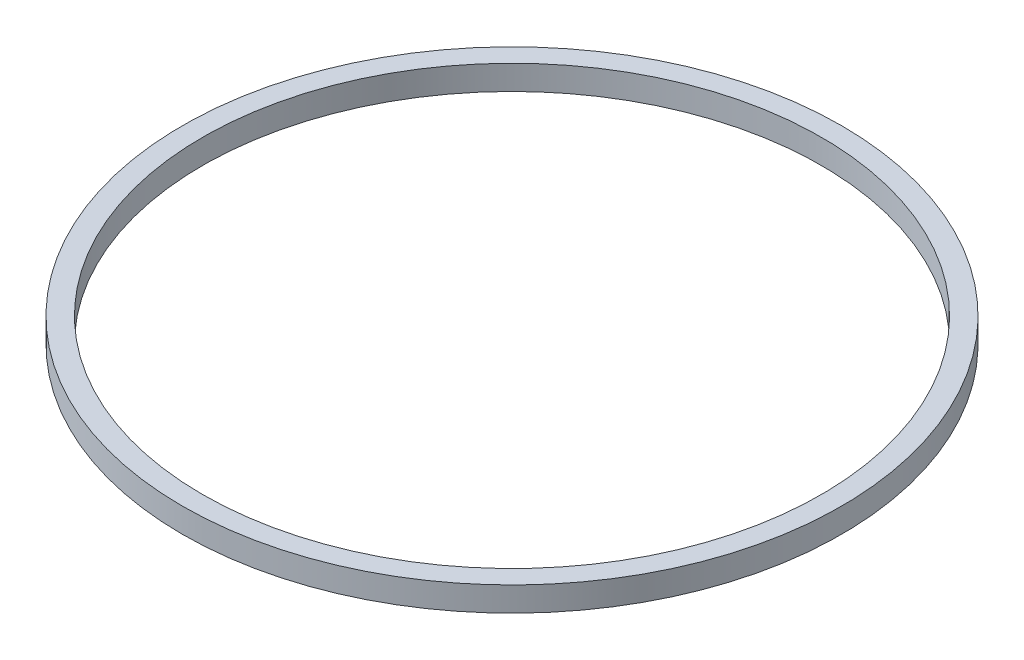
ISO-10303-21;
HEADER;
FILE_DESCRIPTION(('STEP AP214'),'2;1');
FILE_NAME('part.step','',(''),(''),'','','');
FILE_SCHEMA(('AUTOMOTIVE_DESIGN { 1 0 10303 214 1 1 1 1 }'));
ENDSEC;
DATA;
#1=APPLICATION_CONTEXT('core data for automotive mechanical design processes');
#2=APPLICATION_PROTOCOL_DEFINITION('international standard','automotive_design',2000,#1);
#3=PRODUCT_CONTEXT('',#1,'mechanical');
#4=PRODUCT('Part','Part','',(#3));
#5=PRODUCT_RELATED_PRODUCT_CATEGORY('part','',(#4));
#6=PRODUCT_DEFINITION_FORMATION('','',#4);
#7=PRODUCT_DEFINITION_CONTEXT('part definition',#1,'design');
#8=PRODUCT_DEFINITION('design','',#6,#7);
#9=PRODUCT_DEFINITION_SHAPE('','',#8);
#10=(LENGTH_UNIT() NAMED_UNIT(*) SI_UNIT(.MILLI.,.METRE.));
#11=(NAMED_UNIT(*) PLANE_ANGLE_UNIT() SI_UNIT($,.RADIAN.));
#12=(NAMED_UNIT(*) SI_UNIT($,.STERADIAN.) SOLID_ANGLE_UNIT());
#13=UNCERTAINTY_MEASURE_WITH_UNIT(LENGTH_MEASURE(1.E-05),#10,'distance_accuracy_value','');
#14=(GEOMETRIC_REPRESENTATION_CONTEXT(3) GLOBAL_UNCERTAINTY_ASSIGNED_CONTEXT((#13)) GLOBAL_UNIT_ASSIGNED_CONTEXT((#10,
#11,#12)) REPRESENTATION_CONTEXT('',''));
#15=CARTESIAN_POINT('',(0.,0.,0.));
#16=DIRECTION('',(0.,0.,1.));
#17=DIRECTION('',(1.,0.,0.));
#18=AXIS2_PLACEMENT_3D('',#15,#16,#17);
#19=CARTESIAN_POINT('',(0.,6.35,0.));
#20=DIRECTION('',(0.,1.,0.));
#21=DIRECTION('',(0.,0.,1.));
#22=AXIS2_PLACEMENT_3D('',#19,#20,#21);
#23=PLANE('',#22);
#24=CARTESIAN_POINT('',(0.,6.35,0.));
#25=DIRECTION('',(0.,1.,0.));
#26=DIRECTION('',(0.,0.,1.));
#27=AXIS2_PLACEMENT_3D('',#24,#25,#26);
#28=CIRCLE('',#27,85.6234);
#29=CARTESIAN_POINT('',(0.,6.35,85.6234));
#30=VERTEX_POINT('',#29);
#31=EDGE_CURVE('E10',#30,#30,#28,.T.);
#32=ORIENTED_EDGE('',*,*,#31,.T.);
#33=EDGE_LOOP('',(#32));
#34=FACE_BOUND('',#33,.T.);
#35=CARTESIAN_POINT('',(0.,6.35,0.));
#36=DIRECTION('',(0.,1.,0.));
#37=DIRECTION('',(0.,0.,1.));
#38=AXIS2_PLACEMENT_3D('',#35,#36,#37);
#39=CIRCLE('',#38,80.391);
#40=CARTESIAN_POINT('',(0.,6.35,80.391));
#41=VERTEX_POINT('',#40);
#42=EDGE_CURVE('E42',#41,#41,#39,.T.);
#43=ORIENTED_EDGE('',*,*,#42,.F.);
#44=EDGE_LOOP('',(#43));
#45=FACE_BOUND('',#44,.T.);
#46=ADVANCED_FACE('F31',(#34,#45),#23,.T.);
#47=CARTESIAN_POINT('',(0.,0.,0.));
#48=DIRECTION('',(0.,1.,0.));
#49=DIRECTION('',(0.,0.,1.));
#50=AXIS2_PLACEMENT_3D('',#47,#48,#49);
#51=PLANE('',#50);
#52=CARTESIAN_POINT('',(0.,0.,0.));
#53=DIRECTION('',(0.,1.,0.));
#54=DIRECTION('',(0.,0.,1.));
#55=AXIS2_PLACEMENT_3D('',#52,#53,#54);
#56=CIRCLE('',#55,85.6234);
#57=CARTESIAN_POINT('',(0.,0.,85.6234));
#58=VERTEX_POINT('',#57);
#59=EDGE_CURVE('E35',#58,#58,#56,.T.);
#60=ORIENTED_EDGE('',*,*,#59,.F.);
#61=EDGE_LOOP('',(#60));
#62=FACE_BOUND('',#61,.T.);
#63=CARTESIAN_POINT('',(0.,0.,0.));
#64=DIRECTION('',(0.,1.,0.));
#65=DIRECTION('',(0.,0.,1.));
#66=AXIS2_PLACEMENT_3D('',#63,#64,#65);
#67=CIRCLE('',#66,80.391);
#68=CARTESIAN_POINT('',(0.,0.,80.391));
#69=VERTEX_POINT('',#68);
#70=EDGE_CURVE('E44',#69,#69,#67,.T.);
#71=ORIENTED_EDGE('',*,*,#70,.T.);
#72=EDGE_LOOP('',(#71));
#73=FACE_BOUND('',#72,.T.);
#74=ADVANCED_FACE('F54',(#62,#73),#51,.F.);
#75=CARTESIAN_POINT('',(0.,6.35,0.));
#76=DIRECTION('',(0.,-1.,0.));
#77=DIRECTION('',(0.,0.,-1.));
#78=AXIS2_PLACEMENT_3D('',#75,#76,#77);
#79=CYLINDRICAL_SURFACE('',#78,85.6234);
#80=ORIENTED_EDGE('',*,*,#31,.F.);
#81=EDGE_LOOP('',(#80));
#82=FACE_BOUND('',#81,.T.);
#83=ORIENTED_EDGE('',*,*,#59,.T.);
#84=EDGE_LOOP('',(#83));
#85=FACE_BOUND('',#84,.T.);
#86=ADVANCED_FACE('F33',(#82,#85),#79,.T.);
#87=CARTESIAN_POINT('',(0.,6.35,0.));
#88=DIRECTION('',(0.,-1.,0.));
#89=DIRECTION('',(0.,0.,-1.));
#90=AXIS2_PLACEMENT_3D('',#87,#88,#89);
#91=CYLINDRICAL_SURFACE('',#90,80.391);
#92=ORIENTED_EDGE('',*,*,#42,.T.);
#93=EDGE_LOOP('',(#92));
#94=FACE_BOUND('',#93,.T.);
#95=ORIENTED_EDGE('',*,*,#70,.F.);
#96=EDGE_LOOP('',(#95));
#97=FACE_BOUND('',#96,.T.);
#98=ADVANCED_FACE('F50',(#94,#97),#91,.F.);
#99=CLOSED_SHELL('',(#46,#74,#86,#98));
#100=MANIFOLD_SOLID_BREP('B2',#99);
#101=ADVANCED_BREP_SHAPE_REPRESENTATION('',(#18,#100),#14);
#102=SHAPE_DEFINITION_REPRESENTATION(#9,#101);
ENDSEC;
END-ISO-10303-21;
